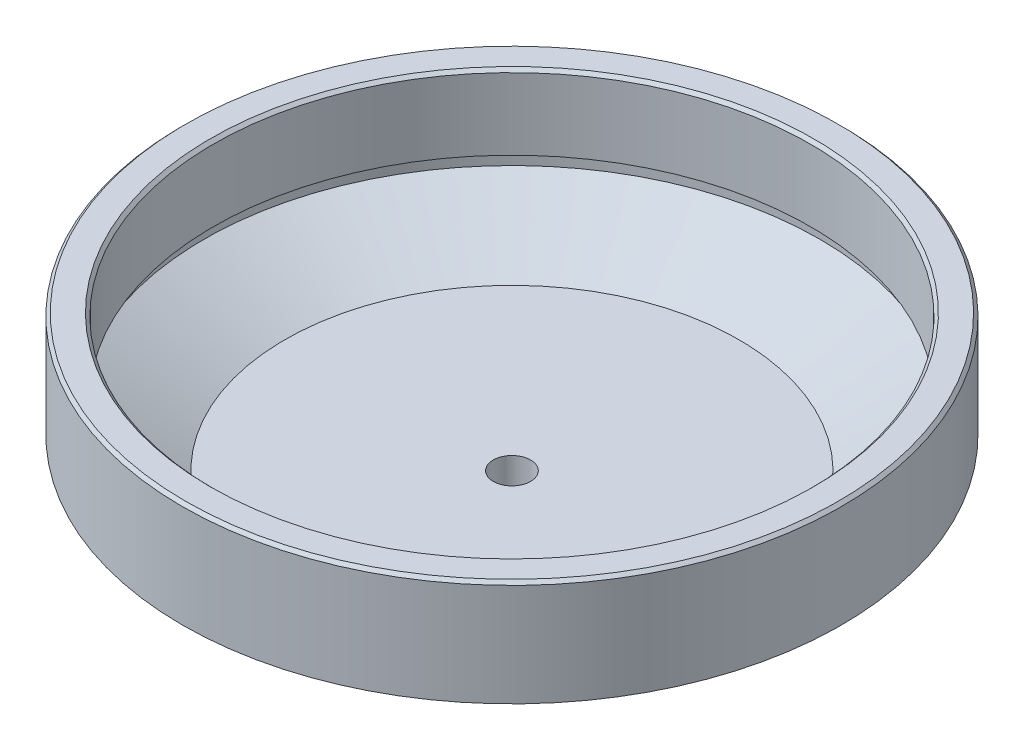
ISO-10303-21;
HEADER;
FILE_DESCRIPTION(('STEP AP214'),'2;1');
FILE_NAME('part.step','',(''),(''),'','','');
FILE_SCHEMA(('AUTOMOTIVE_DESIGN { 1 0 10303 214 1 1 1 1 }'));
ENDSEC;
DATA;
#1=APPLICATION_CONTEXT('core data for automotive mechanical design processes');
#2=APPLICATION_PROTOCOL_DEFINITION('international standard','automotive_design',2000,#1);
#3=PRODUCT_CONTEXT('',#1,'mechanical');
#4=PRODUCT('Part','Part','',(#3));
#5=PRODUCT_RELATED_PRODUCT_CATEGORY('part','',(#4));
#6=PRODUCT_DEFINITION_FORMATION('','',#4);
#7=PRODUCT_DEFINITION_CONTEXT('part definition',#1,'design');
#8=PRODUCT_DEFINITION('design','',#6,#7);
#9=PRODUCT_DEFINITION_SHAPE('','',#8);
#10=(LENGTH_UNIT() NAMED_UNIT(*) SI_UNIT(.MILLI.,.METRE.));
#11=(NAMED_UNIT(*) PLANE_ANGLE_UNIT() SI_UNIT($,.RADIAN.));
#12=(NAMED_UNIT(*) SI_UNIT($,.STERADIAN.) SOLID_ANGLE_UNIT());
#13=UNCERTAINTY_MEASURE_WITH_UNIT(LENGTH_MEASURE(1.E-05),#10,'distance_accuracy_value','');
#14=(GEOMETRIC_REPRESENTATION_CONTEXT(3) GLOBAL_UNCERTAINTY_ASSIGNED_CONTEXT((#13)) GLOBAL_UNIT_ASSIGNED_CONTEXT((#10,
#11,#12)) REPRESENTATION_CONTEXT('',''));
#15=CARTESIAN_POINT('',(0.,0.,0.));
#16=DIRECTION('',(0.,0.,1.));
#17=DIRECTION('',(1.,0.,0.));
#18=AXIS2_PLACEMENT_3D('',#15,#16,#17);
#19=CARTESIAN_POINT('',(48.,28.,-3.35182208528941E-13));
#20=DIRECTION('',(0.,1.,0.));
#21=DIRECTION('',(0.,0.,1.));
#22=AXIS2_PLACEMENT_3D('',#19,#20,#21);
#23=PLANE('',#22);
#24=CARTESIAN_POINT('',(0.,28.,0.));
#25=DIRECTION('',(0.,1.,0.));
#26=DIRECTION('',(0.,0.,1.));
#27=AXIS2_PLACEMENT_3D('',#24,#25,#26);
#28=CIRCLE('',#27,52.5);
#29=CARTESIAN_POINT('',(0.,28.,52.5));
#30=VERTEX_POINT('',#29);
#31=EDGE_CURVE('E46',#30,#30,#28,.T.);
#32=ORIENTED_EDGE('',*,*,#31,.T.);
#33=EDGE_LOOP('',(#32));
#34=FACE_BOUND('',#33,.T.);
#35=CARTESIAN_POINT('',(0.,28.,0.));
#36=DIRECTION('',(0.,1.,0.));
#37=DIRECTION('',(0.,0.,1.));
#38=AXIS2_PLACEMENT_3D('',#35,#36,#37);
#39=CIRCLE('',#38,48.5);
#40=CARTESIAN_POINT('',(0.,28.,48.5));
#41=VERTEX_POINT('',#40);
#42=EDGE_CURVE('E50',#41,#41,#39,.F.);
#43=ORIENTED_EDGE('',*,*,#42,.T.);
#44=EDGE_LOOP('',(#43));
#45=FACE_BOUND('',#44,.T.);
#46=ADVANCED_FACE('F35',(#34,#45),#23,.T.);
#47=CARTESIAN_POINT('',(0.,26.1689859870494,0.));
#48=DIRECTION('',(0.,1.,0.));
#49=DIRECTION('',(0.,0.,1.));
#50=AXIS2_PLACEMENT_3D('',#47,#48,#49);
#51=CYLINDRICAL_SURFACE('',#50,53.);
#52=CARTESIAN_POINT('',(0.,27.5,0.));
#53=DIRECTION('',(0.,1.,0.));
#54=DIRECTION('',(0.,0.,1.));
#55=AXIS2_PLACEMENT_3D('',#52,#53,#54);
#56=CIRCLE('',#55,53.);
#57=CARTESIAN_POINT('',(0.,27.5,53.));
#58=VERTEX_POINT('',#57);
#59=EDGE_CURVE('E42',#58,#58,#56,.F.);
#60=ORIENTED_EDGE('',*,*,#59,.T.);
#61=EDGE_LOOP('',(#60));
#62=FACE_BOUND('',#61,.T.);
#63=CARTESIAN_POINT('',(0.,11.,0.));
#64=DIRECTION('',(0.,1.,0.));
#65=DIRECTION('',(0.,0.,1.));
#66=AXIS2_PLACEMENT_3D('',#63,#64,#65);
#67=CIRCLE('',#66,53.);
#68=CARTESIAN_POINT('',(0.,11.,53.));
#69=VERTEX_POINT('',#68);
#70=EDGE_CURVE('E61',#69,#69,#67,.T.);
#71=ORIENTED_EDGE('',*,*,#70,.T.);
#72=EDGE_LOOP('',(#71));
#73=FACE_BOUND('',#72,.T.);
#74=ADVANCED_FACE('F100',(#62,#73),#51,.T.);
#75=CARTESIAN_POINT('',(0.,11.,0.));
#76=DIRECTION('',(0.,1.,0.));
#77=DIRECTION('',(0.,0.,1.));
#78=AXIS2_PLACEMENT_3D('',#75,#76,#77);
#79=CONICAL_SURFACE('',#78,53.,1.0471975511966);
#80=CARTESIAN_POINT('',(0.,0.,0.));
#81=DIRECTION('',(0.,1.,0.));
#82=DIRECTION('',(0.,0.,1.));
#83=AXIS2_PLACEMENT_3D('',#80,#81,#82);
#84=CIRCLE('',#83,33.9474411167422);
#85=CARTESIAN_POINT('',(0.,0.,33.9474411167422));
#86=VERTEX_POINT('',#85);
#87=EDGE_CURVE('E64',#86,#86,#84,.T.);
#88=ORIENTED_EDGE('',*,*,#87,.T.);
#89=EDGE_LOOP('',(#88));
#90=FACE_BOUND('',#89,.T.);
#91=ORIENTED_EDGE('',*,*,#70,.F.);
#92=EDGE_LOOP('',(#91));
#93=FACE_BOUND('',#92,.T.);
#94=ADVANCED_FACE('F106',(#90,#93),#79,.T.);
#95=CARTESIAN_POINT('',(33.9474411167422,0.,-2.37053714321163E-13));
#96=DIRECTION('',(0.,-1.,0.));
#97=DIRECTION('',(0.,0.,-1.));
#98=AXIS2_PLACEMENT_3D('',#95,#96,#97);
#99=PLANE('',#98);
#100=CARTESIAN_POINT('',(0.,0.,0.));
#101=DIRECTION('',(0.,-1.,0.));
#102=DIRECTION('',(0.,0.,-1.));
#103=AXIS2_PLACEMENT_3D('',#100,#101,#102);
#104=CIRCLE('',#103,3.5);
#105=CARTESIAN_POINT('',(0.,0.,-3.5));
#106=VERTEX_POINT('',#105);
#107=EDGE_CURVE('E58',#106,#106,#104,.F.);
#108=ORIENTED_EDGE('',*,*,#107,.T.);
#109=EDGE_LOOP('',(#108));
#110=FACE_BOUND('',#109,.T.);
#111=ORIENTED_EDGE('',*,*,#87,.F.);
#112=EDGE_LOOP('',(#111));
#113=FACE_BOUND('',#112,.T.);
#114=ADVANCED_FACE('F151',(#110,#113),#99,.T.);
#115=CARTESIAN_POINT('',(0.,26.1689859870494,0.));
#116=DIRECTION('',(0.,1.,0.));
#117=DIRECTION('',(0.,0.,1.));
#118=AXIS2_PLACEMENT_3D('',#115,#116,#117);
#119=CYLINDRICAL_SURFACE('',#118,3.);
#120=CARTESIAN_POINT('',(0.,0.500000000000011,0.));
#121=DIRECTION('',(0.,-1.,0.));
#122=DIRECTION('',(0.,0.,-1.));
#123=AXIS2_PLACEMENT_3D('',#120,#121,#122);
#124=CIRCLE('',#123,3.);
#125=CARTESIAN_POINT('',(0.,0.500000000000011,-3.));
#126=VERTEX_POINT('',#125);
#127=EDGE_CURVE('E55',#126,#126,#124,.T.);
#128=ORIENTED_EDGE('',*,*,#127,.T.);
#129=EDGE_LOOP('',(#128));
#130=FACE_BOUND('',#129,.T.);
#131=CARTESIAN_POINT('',(0.,6.,0.));
#132=DIRECTION('',(0.,1.,0.));
#133=DIRECTION('',(0.,0.,1.));
#134=AXIS2_PLACEMENT_3D('',#131,#132,#133);
#135=CIRCLE('',#134,3.);
#136=CARTESIAN_POINT('',(0.,6.,3.));
#137=VERTEX_POINT('',#136);
#138=EDGE_CURVE('E67',#137,#137,#135,.T.);
#139=ORIENTED_EDGE('',*,*,#138,.T.);
#140=EDGE_LOOP('',(#139));
#141=FACE_BOUND('',#140,.T.);
#142=ADVANCED_FACE('F145',(#130,#141),#119,.F.);
#143=CARTESIAN_POINT('',(3.,6.,0.));
#144=DIRECTION('',(0.,1.,0.));
#145=DIRECTION('',(0.,0.,1.));
#146=AXIS2_PLACEMENT_3D('',#143,#144,#145);
#147=PLANE('',#146);
#148=CARTESIAN_POINT('',(0.,5.99999999999999,0.));
#149=DIRECTION('',(0.,1.,0.));
#150=DIRECTION('',(0.,0.,1.));
#151=AXIS2_PLACEMENT_3D('',#148,#149,#150);
#152=CIRCLE('',#151,36.5096189432333);
#153=CARTESIAN_POINT('',(0.,5.99999999999999,36.5096189432333));
#154=VERTEX_POINT('',#153);
#155=EDGE_CURVE('E70',#154,#154,#152,.T.);
#156=ORIENTED_EDGE('',*,*,#155,.T.);
#157=EDGE_LOOP('',(#156));
#158=FACE_BOUND('',#157,.T.);
#159=ORIENTED_EDGE('',*,*,#138,.F.);
#160=EDGE_LOOP('',(#159));
#161=FACE_BOUND('',#160,.T.);
#162=ADVANCED_FACE('F150',(#158,#161),#147,.T.);
#163=CARTESIAN_POINT('',(0.,5.99999999999999,0.));
#164=DIRECTION('',(0.,1.,0.));
#165=DIRECTION('',(0.,0.,1.));
#166=AXIS2_PLACEMENT_3D('',#163,#164,#165);
#167=CONICAL_SURFACE('',#166,36.5096189432333,1.0471975511966);
#168=CARTESIAN_POINT('',(0.,13.5,0.));
#169=DIRECTION('',(0.,1.,0.));
#170=DIRECTION('',(0.,0.,1.));
#171=AXIS2_PLACEMENT_3D('',#168,#169,#170);
#172=CIRCLE('',#171,49.5);
#173=CARTESIAN_POINT('',(0.,13.5,49.5));
#174=VERTEX_POINT('',#173);
#175=EDGE_CURVE('E73',#174,#174,#172,.T.);
#176=ORIENTED_EDGE('',*,*,#175,.T.);
#177=EDGE_LOOP('',(#176));
#178=FACE_BOUND('',#177,.T.);
#179=ORIENTED_EDGE('',*,*,#155,.F.);
#180=EDGE_LOOP('',(#179));
#181=FACE_BOUND('',#180,.T.);
#182=ADVANCED_FACE('F188',(#178,#181),#167,.F.);
#183=CARTESIAN_POINT('',(0.,26.1689859870494,0.));
#184=DIRECTION('',(0.,1.,0.));
#185=DIRECTION('',(0.,0.,1.));
#186=AXIS2_PLACEMENT_3D('',#183,#184,#185);
#187=CYLINDRICAL_SURFACE('',#186,49.5);
#188=CARTESIAN_POINT('',(0.,16.,0.));
#189=DIRECTION('',(0.,1.,0.));
#190=DIRECTION('',(0.,0.,1.));
#191=AXIS2_PLACEMENT_3D('',#188,#189,#190);
#192=CIRCLE('',#191,49.5);
#193=CARTESIAN_POINT('',(0.,16.,49.5));
#194=VERTEX_POINT('',#193);
#195=EDGE_CURVE('E76',#194,#194,#192,.T.);
#196=ORIENTED_EDGE('',*,*,#195,.T.);
#197=EDGE_LOOP('',(#196));
#198=FACE_BOUND('',#197,.T.);
#199=ORIENTED_EDGE('',*,*,#175,.F.);
#200=EDGE_LOOP('',(#199));
#201=FACE_BOUND('',#200,.T.);
#202=ADVANCED_FACE('F97',(#198,#201),#187,.F.);
#203=CARTESIAN_POINT('',(49.5,16.,-3.4565665254547E-13));
#204=DIRECTION('',(0.,-1.,0.));
#205=DIRECTION('',(0.,0.,-1.));
#206=AXIS2_PLACEMENT_3D('',#203,#204,#205);
#207=PLANE('',#206);
#208=CARTESIAN_POINT('',(0.,16.,0.));
#209=DIRECTION('',(0.,1.,0.));
#210=DIRECTION('',(0.,0.,1.));
#211=AXIS2_PLACEMENT_3D('',#208,#209,#210);
#212=CIRCLE('',#211,48.);
#213=CARTESIAN_POINT('',(0.,16.,48.));
#214=VERTEX_POINT('',#213);
#215=EDGE_CURVE('E79',#214,#214,#212,.T.);
#216=ORIENTED_EDGE('',*,*,#215,.T.);
#217=EDGE_LOOP('',(#216));
#218=FACE_BOUND('',#217,.T.);
#219=ORIENTED_EDGE('',*,*,#195,.F.);
#220=EDGE_LOOP('',(#219));
#221=FACE_BOUND('',#220,.T.);
#222=ADVANCED_FACE('F83',(#218,#221),#207,.T.);
#223=CARTESIAN_POINT('',(0.,26.1689859870494,0.));
#224=DIRECTION('',(0.,1.,0.));
#225=DIRECTION('',(0.,0.,1.));
#226=AXIS2_PLACEMENT_3D('',#223,#224,#225);
#227=CYLINDRICAL_SURFACE('',#226,48.);
#228=CARTESIAN_POINT('',(0.,27.5,0.));
#229=DIRECTION('',(0.,1.,0.));
#230=DIRECTION('',(0.,0.,1.));
#231=AXIS2_PLACEMENT_3D('',#228,#229,#230);
#232=CIRCLE('',#231,48.);
#233=CARTESIAN_POINT('',(0.,27.5,48.));
#234=VERTEX_POINT('',#233);
#235=EDGE_CURVE('E10',#234,#234,#232,.T.);
#236=ORIENTED_EDGE('',*,*,#235,.T.);
#237=EDGE_LOOP('',(#236));
#238=FACE_BOUND('',#237,.T.);
#239=ORIENTED_EDGE('',*,*,#215,.F.);
#240=EDGE_LOOP('',(#239));
#241=FACE_BOUND('',#240,.T.);
#242=ADVANCED_FACE('F86',(#238,#241),#227,.F.);
#243=CARTESIAN_POINT('',(0.,0.,0.));
#244=DIRECTION('',(0.,-1.,0.));
#245=DIRECTION('',(0.,0.,-1.));
#246=AXIS2_PLACEMENT_3D('',#243,#244,#245);
#247=CONICAL_SURFACE('',#246,3.5,0.785398163397444);
#248=ORIENTED_EDGE('',*,*,#127,.F.);
#249=EDGE_LOOP('',(#248));
#250=FACE_BOUND('',#249,.T.);
#251=ORIENTED_EDGE('',*,*,#107,.F.);
#252=EDGE_LOOP('',(#251));
#253=FACE_BOUND('',#252,.T.);
#254=ADVANCED_FACE('F88',(#250,#253),#247,.F.);
#255=CARTESIAN_POINT('',(0.,28.,0.));
#256=DIRECTION('',(0.,-1.,0.));
#257=DIRECTION('',(0.,0.,-1.));
#258=AXIS2_PLACEMENT_3D('',#255,#256,#257);
#259=CONICAL_SURFACE('',#258,52.5,0.785398163397448);
#260=ORIENTED_EDGE('',*,*,#59,.F.);
#261=EDGE_LOOP('',(#260));
#262=FACE_BOUND('',#261,.T.);
#263=ORIENTED_EDGE('',*,*,#31,.F.);
#264=EDGE_LOOP('',(#263));
#265=FACE_BOUND('',#264,.T.);
#266=ADVANCED_FACE('F94',(#262,#265),#259,.T.);
#267=CARTESIAN_POINT('',(0.,27.5,0.));
#268=DIRECTION('',(0.,1.,0.));
#269=DIRECTION('',(0.,0.,1.));
#270=AXIS2_PLACEMENT_3D('',#267,#268,#269);
#271=CONICAL_SURFACE('',#270,48.,0.785398163397441);
#272=ORIENTED_EDGE('',*,*,#42,.F.);
#273=EDGE_LOOP('',(#272));
#274=FACE_BOUND('',#273,.T.);
#275=ORIENTED_EDGE('',*,*,#235,.F.);
#276=EDGE_LOOP('',(#275));
#277=FACE_BOUND('',#276,.T.);
#278=ADVANCED_FACE('F37',(#274,#277),#271,.F.);
#279=CLOSED_SHELL('',(#46,#74,#94,#114,#142,#162,#182,#202,#222,#242,#254,#266,#278));
#280=MANIFOLD_SOLID_BREP('B2',#279);
#281=ADVANCED_BREP_SHAPE_REPRESENTATION('',(#18,#280),#14);
#282=SHAPE_DEFINITION_REPRESENTATION(#9,#281);
ENDSEC;
END-ISO-10303-21;
